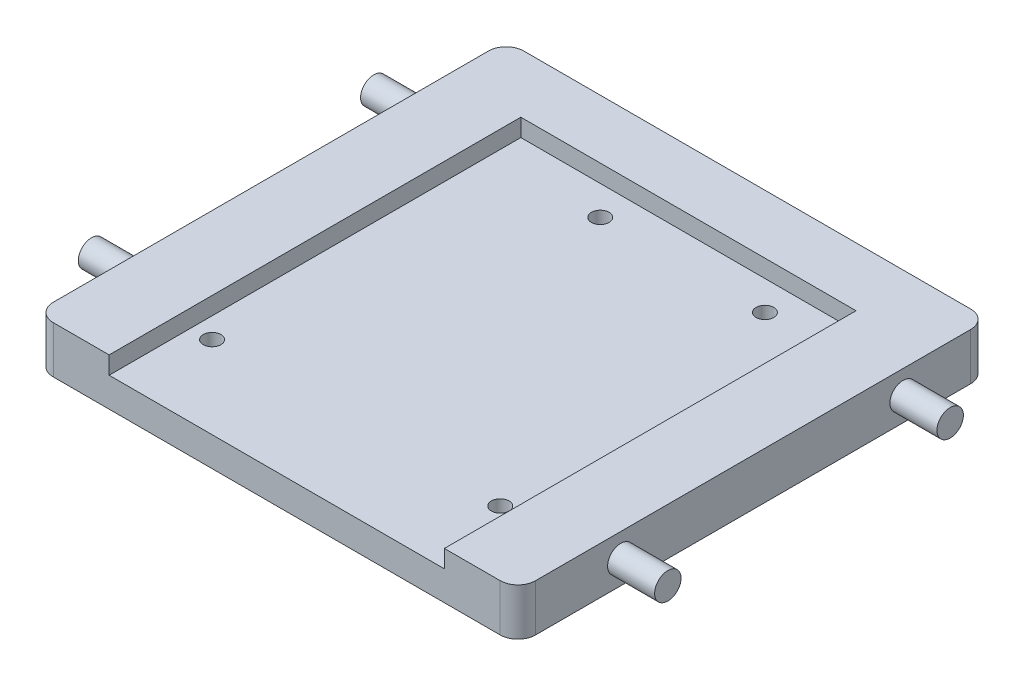
ISO-10303-21;
HEADER;
FILE_DESCRIPTION(('STEP AP214'),'2;1');
FILE_NAME('part.step','',(''),(''),'','','');
FILE_SCHEMA(('AUTOMOTIVE_DESIGN { 1 0 10303 214 1 1 1 1 }'));
ENDSEC;
DATA;
#1=APPLICATION_CONTEXT('core data for automotive mechanical design processes');
#2=APPLICATION_PROTOCOL_DEFINITION('international standard','automotive_design',2000,#1);
#3=PRODUCT_CONTEXT('',#1,'mechanical');
#4=PRODUCT('Part','Part','',(#3));
#5=PRODUCT_RELATED_PRODUCT_CATEGORY('part','',(#4));
#6=PRODUCT_DEFINITION_FORMATION('','',#4);
#7=PRODUCT_DEFINITION_CONTEXT('part definition',#1,'design');
#8=PRODUCT_DEFINITION('design','',#6,#7);
#9=PRODUCT_DEFINITION_SHAPE('','',#8);
#10=(LENGTH_UNIT() NAMED_UNIT(*) SI_UNIT(.MILLI.,.METRE.));
#11=(NAMED_UNIT(*) PLANE_ANGLE_UNIT() SI_UNIT($,.RADIAN.));
#12=(NAMED_UNIT(*) SI_UNIT($,.STERADIAN.) SOLID_ANGLE_UNIT());
#13=UNCERTAINTY_MEASURE_WITH_UNIT(LENGTH_MEASURE(1.E-05),#10,'distance_accuracy_value','');
#14=(GEOMETRIC_REPRESENTATION_CONTEXT(3) GLOBAL_UNCERTAINTY_ASSIGNED_CONTEXT((#13)) GLOBAL_UNIT_ASSIGNED_CONTEXT((#10,
#11,#12)) REPRESENTATION_CONTEXT('',''));
#15=CARTESIAN_POINT('',(0.,0.,0.));
#16=DIRECTION('',(0.,0.,1.));
#17=DIRECTION('',(1.,0.,0.));
#18=AXIS2_PLACEMENT_3D('',#15,#16,#17);
#19=CARTESIAN_POINT('',(-41.,8.,-80.));
#20=DIRECTION('',(1.,0.,0.));
#21=DIRECTION('',(0.,0.,-1.));
#22=AXIS2_PLACEMENT_3D('',#19,#20,#21);
#23=PLANE('',#22);
#24=CARTESIAN_POINT('',(-41.,4.,-65.5));
#25=DIRECTION('',(1.,0.,0.));
#26=DIRECTION('',(0.,0.,-1.));
#27=AXIS2_PLACEMENT_3D('',#24,#25,#26);
#28=CIRCLE('',#27,2.25);
#29=CARTESIAN_POINT('',(-41.,4.,-67.75));
#30=VERTEX_POINT('',#29);
#31=EDGE_CURVE('E196',#30,#30,#28,.T.);
#32=ORIENTED_EDGE('',*,*,#31,.T.);
#33=EDGE_LOOP('',(#32));
#34=FACE_BOUND('',#33,.T.);
#35=CARTESIAN_POINT('',(-41.,4.,-17.5));
#36=DIRECTION('',(1.,0.,0.));
#37=DIRECTION('',(0.,0.,-1.));
#38=AXIS2_PLACEMENT_3D('',#35,#36,#37);
#39=CIRCLE('',#38,2.25);
#40=CARTESIAN_POINT('',(-41.,4.,-19.75));
#41=VERTEX_POINT('',#40);
#42=EDGE_CURVE('E209',#41,#41,#39,.T.);
#43=ORIENTED_EDGE('',*,*,#42,.T.);
#44=EDGE_LOOP('',(#43));
#45=FACE_BOUND('',#44,.T.);
#46=DIRECTION('',(0.,0.,1.));
#47=VECTOR('',#46,1.);
#48=CARTESIAN_POINT('',(-41.,8.,-80.));
#49=LINE('',#48,#47);
#50=CARTESIAN_POINT('',(-41.,8.,-77.));
#51=VERTEX_POINT('',#50);
#52=CARTESIAN_POINT('',(-41.,8.,-3.));
#53=VERTEX_POINT('',#52);
#54=EDGE_CURVE('E214',#51,#53,#49,.T.);
#55=ORIENTED_EDGE('',*,*,#54,.F.);
#56=DIRECTION('',(0.,-1.,0.));
#57=VECTOR('',#56,1.);
#58=CARTESIAN_POINT('',(-41.,8.,-77.));
#59=LINE('',#58,#57);
#60=CARTESIAN_POINT('',(-41.,0.,-77.));
#61=VERTEX_POINT('',#60);
#62=EDGE_CURVE('E250',#51,#61,#59,.T.);
#63=ORIENTED_EDGE('',*,*,#62,.T.);
#64=DIRECTION('',(0.,0.,1.));
#65=VECTOR('',#64,1.);
#66=CARTESIAN_POINT('',(-41.,0.,-80.));
#67=LINE('',#66,#65);
#68=CARTESIAN_POINT('',(-41.,0.,-3.));
#69=VERTEX_POINT('',#68);
#70=EDGE_CURVE('E213',#61,#69,#67,.T.);
#71=ORIENTED_EDGE('',*,*,#70,.T.);
#72=DIRECTION('',(0.,-1.,0.));
#73=VECTOR('',#72,1.);
#74=CARTESIAN_POINT('',(-41.,8.,-3.));
#75=LINE('',#74,#73);
#76=EDGE_CURVE('E229',#69,#53,#75,.F.);
#77=ORIENTED_EDGE('',*,*,#76,.T.);
#78=EDGE_LOOP('',(#55,#63,#71,#77));
#79=FACE_BOUND('',#78,.T.);
#80=ADVANCED_FACE('F41',(#34,#45,#79),#23,.F.);
#81=CARTESIAN_POINT('',(-41.,8.,0.));
#82=DIRECTION('',(0.,0.,-1.));
#83=DIRECTION('',(-1.,0.,0.));
#84=AXIS2_PLACEMENT_3D('',#81,#82,#83);
#85=PLANE('',#84);
#86=DIRECTION('',(1.,0.,0.));
#87=VECTOR('',#86,1.);
#88=CARTESIAN_POINT('',(-41.,0.,0.));
#89=LINE('',#88,#87);
#90=CARTESIAN_POINT('',(-38.,0.,0.));
#91=VERTEX_POINT('',#90);
#92=CARTESIAN_POINT('',(38.,0.,0.));
#93=VERTEX_POINT('',#92);
#94=EDGE_CURVE('E233',#91,#93,#89,.T.);
#95=ORIENTED_EDGE('',*,*,#94,.T.);
#96=DIRECTION('',(0.,-1.,0.));
#97=VECTOR('',#96,1.);
#98=CARTESIAN_POINT('',(38.,8.,0.));
#99=LINE('',#98,#97);
#100=CARTESIAN_POINT('',(38.,8.,0.));
#101=VERTEX_POINT('',#100);
#102=EDGE_CURVE('E12',#93,#101,#99,.F.);
#103=ORIENTED_EDGE('',*,*,#102,.T.);
#104=DIRECTION('',(1.,0.,0.));
#105=VECTOR('',#104,1.);
#106=CARTESIAN_POINT('',(-41.,8.,0.));
#107=LINE('',#106,#105);
#108=CARTESIAN_POINT('',(28.5,8.,0.));
#109=VERTEX_POINT('',#108);
#110=EDGE_CURVE('E217',#109,#101,#107,.T.);
#111=ORIENTED_EDGE('',*,*,#110,.F.);
#112=DIRECTION('',(0.,1.,0.));
#113=VECTOR('',#112,1.);
#114=CARTESIAN_POINT('',(28.5,5.,0.));
#115=LINE('',#114,#113);
#116=CARTESIAN_POINT('',(28.5,5.,0.));
#117=VERTEX_POINT('',#116);
#118=EDGE_CURVE('E144',#117,#109,#115,.T.);
#119=ORIENTED_EDGE('',*,*,#118,.F.);
#120=DIRECTION('',(1.,0.,0.));
#121=VECTOR('',#120,1.);
#122=CARTESIAN_POINT('',(28.5,5.,0.));
#123=LINE('',#122,#121);
#124=CARTESIAN_POINT('',(-28.5,5.,0.));
#125=VERTEX_POINT('',#124);
#126=EDGE_CURVE('E151',#125,#117,#123,.T.);
#127=ORIENTED_EDGE('',*,*,#126,.F.);
#128=DIRECTION('',(0.,1.,0.));
#129=VECTOR('',#128,1.);
#130=CARTESIAN_POINT('',(-28.5,5.,0.));
#131=LINE('',#130,#129);
#132=CARTESIAN_POINT('',(-28.5,8.,0.));
#133=VERTEX_POINT('',#132);
#134=EDGE_CURVE('E134',#125,#133,#131,.T.);
#135=ORIENTED_EDGE('',*,*,#134,.T.);
#136=CARTESIAN_POINT('',(-38.,8.,0.));
#137=VERTEX_POINT('',#136);
#138=EDGE_CURVE('E219',#137,#133,#107,.T.);
#139=ORIENTED_EDGE('',*,*,#138,.F.);
#140=DIRECTION('',(0.,-1.,0.));
#141=VECTOR('',#140,1.);
#142=CARTESIAN_POINT('',(-38.,8.,0.));
#143=LINE('',#142,#141);
#144=EDGE_CURVE('E50',#137,#91,#143,.T.);
#145=ORIENTED_EDGE('',*,*,#144,.T.);
#146=EDGE_LOOP('',(#95,#103,#111,#119,#127,#135,#139,#145));
#147=FACE_BOUND('',#146,.T.);
#148=ADVANCED_FACE('F158',(#147),#85,.F.);
#149=CARTESIAN_POINT('',(41.,8.,0.));
#150=DIRECTION('',(-1.,0.,0.));
#151=DIRECTION('',(0.,0.,1.));
#152=AXIS2_PLACEMENT_3D('',#149,#150,#151);
#153=PLANE('',#152);
#154=CARTESIAN_POINT('',(41.,4.,-65.5));
#155=DIRECTION('',(-1.,0.,0.));
#156=DIRECTION('',(0.,0.,1.));
#157=AXIS2_PLACEMENT_3D('',#154,#155,#156);
#158=CIRCLE('',#157,2.25);
#159=CARTESIAN_POINT('',(41.,4.,-63.25));
#160=VERTEX_POINT('',#159);
#161=EDGE_CURVE('E195',#160,#160,#158,.T.);
#162=ORIENTED_EDGE('',*,*,#161,.T.);
#163=EDGE_LOOP('',(#162));
#164=FACE_BOUND('',#163,.T.);
#165=CARTESIAN_POINT('',(41.,4.,-17.5));
#166=DIRECTION('',(-1.,0.,0.));
#167=DIRECTION('',(0.,0.,1.));
#168=AXIS2_PLACEMENT_3D('',#165,#166,#167);
#169=CIRCLE('',#168,2.25);
#170=CARTESIAN_POINT('',(41.,4.,-15.25));
#171=VERTEX_POINT('',#170);
#172=EDGE_CURVE('E208',#171,#171,#169,.T.);
#173=ORIENTED_EDGE('',*,*,#172,.T.);
#174=EDGE_LOOP('',(#173));
#175=FACE_BOUND('',#174,.T.);
#176=DIRECTION('',(0.,0.,-1.));
#177=VECTOR('',#176,1.);
#178=CARTESIAN_POINT('',(41.,0.,0.));
#179=LINE('',#178,#177);
#180=CARTESIAN_POINT('',(41.,0.,-3.));
#181=VERTEX_POINT('',#180);
#182=CARTESIAN_POINT('',(41.,0.,-77.));
#183=VERTEX_POINT('',#182);
#184=EDGE_CURVE('E236',#181,#183,#179,.T.);
#185=ORIENTED_EDGE('',*,*,#184,.T.);
#186=DIRECTION('',(0.,-1.,0.));
#187=VECTOR('',#186,1.);
#188=CARTESIAN_POINT('',(41.,8.,-77.));
#189=LINE('',#188,#187);
#190=CARTESIAN_POINT('',(41.,8.,-77.));
#191=VERTEX_POINT('',#190);
#192=EDGE_CURVE('E65',#183,#191,#189,.F.);
#193=ORIENTED_EDGE('',*,*,#192,.T.);
#194=DIRECTION('',(0.,0.,-1.));
#195=VECTOR('',#194,1.);
#196=CARTESIAN_POINT('',(41.,8.,0.));
#197=LINE('',#196,#195);
#198=CARTESIAN_POINT('',(41.,8.,-3.));
#199=VERTEX_POINT('',#198);
#200=EDGE_CURVE('E222',#199,#191,#197,.T.);
#201=ORIENTED_EDGE('',*,*,#200,.F.);
#202=DIRECTION('',(0.,-1.,0.));
#203=VECTOR('',#202,1.);
#204=CARTESIAN_POINT('',(41.,8.,-3.));
#205=LINE('',#204,#203);
#206=EDGE_CURVE('E284',#199,#181,#205,.T.);
#207=ORIENTED_EDGE('',*,*,#206,.T.);
#208=EDGE_LOOP('',(#185,#193,#201,#207));
#209=FACE_BOUND('',#208,.T.);
#210=ADVANCED_FACE('F303',(#164,#175,#209),#153,.F.);
#211=CARTESIAN_POINT('',(41.,8.,-80.));
#212=DIRECTION('',(0.,0.,1.));
#213=DIRECTION('',(1.,0.,0.));
#214=AXIS2_PLACEMENT_3D('',#211,#212,#213);
#215=PLANE('',#214);
#216=DIRECTION('',(-1.,0.,0.));
#217=VECTOR('',#216,1.);
#218=CARTESIAN_POINT('',(41.,0.,-80.));
#219=LINE('',#218,#217);
#220=CARTESIAN_POINT('',(38.,0.,-80.));
#221=VERTEX_POINT('',#220);
#222=CARTESIAN_POINT('',(-38.,0.,-80.));
#223=VERTEX_POINT('',#222);
#224=EDGE_CURVE('E218',#221,#223,#219,.T.);
#225=ORIENTED_EDGE('',*,*,#224,.T.);
#226=DIRECTION('',(0.,-1.,0.));
#227=VECTOR('',#226,1.);
#228=CARTESIAN_POINT('',(-38.,8.,-80.));
#229=LINE('',#228,#227);
#230=CARTESIAN_POINT('',(-38.,8.,-80.));
#231=VERTEX_POINT('',#230);
#232=EDGE_CURVE('E270',#223,#231,#229,.F.);
#233=ORIENTED_EDGE('',*,*,#232,.T.);
#234=DIRECTION('',(-1.,0.,0.));
#235=VECTOR('',#234,1.);
#236=CARTESIAN_POINT('',(41.,8.,-80.));
#237=LINE('',#236,#235);
#238=CARTESIAN_POINT('',(38.,8.,-80.));
#239=VERTEX_POINT('',#238);
#240=EDGE_CURVE('E225',#239,#231,#237,.T.);
#241=ORIENTED_EDGE('',*,*,#240,.F.);
#242=DIRECTION('',(0.,-1.,0.));
#243=VECTOR('',#242,1.);
#244=CARTESIAN_POINT('',(38.,8.,-80.));
#245=LINE('',#244,#243);
#246=EDGE_CURVE('E266',#239,#221,#245,.T.);
#247=ORIENTED_EDGE('',*,*,#246,.T.);
#248=EDGE_LOOP('',(#225,#233,#241,#247));
#249=FACE_BOUND('',#248,.T.);
#250=ADVANCED_FACE('F313',(#249),#215,.F.);
#251=CARTESIAN_POINT('',(0.,8.,0.));
#252=DIRECTION('',(0.,1.,0.));
#253=DIRECTION('',(0.,0.,1.));
#254=AXIS2_PLACEMENT_3D('',#251,#252,#253);
#255=PLANE('',#254);
#256=ORIENTED_EDGE('',*,*,#240,.T.);
#257=CARTESIAN_POINT('',(-38.,8.,-77.));
#258=DIRECTION('',(0.,1.,0.));
#259=DIRECTION('',(0.,0.,1.));
#260=AXIS2_PLACEMENT_3D('',#257,#258,#259);
#261=CIRCLE('',#260,3.);
#262=EDGE_CURVE('E281',#231,#51,#261,.T.);
#263=ORIENTED_EDGE('',*,*,#262,.T.);
#264=ORIENTED_EDGE('',*,*,#54,.T.);
#265=CARTESIAN_POINT('',(-38.,8.,-3.));
#266=DIRECTION('',(0.,1.,0.));
#267=DIRECTION('',(0.,0.,1.));
#268=AXIS2_PLACEMENT_3D('',#265,#266,#267);
#269=CIRCLE('',#268,3.);
#270=EDGE_CURVE('E57',#53,#137,#269,.T.);
#271=ORIENTED_EDGE('',*,*,#270,.T.);
#272=ORIENTED_EDGE('',*,*,#138,.T.);
#273=DIRECTION('',(0.,0.,1.));
#274=VECTOR('',#273,1.);
#275=CARTESIAN_POINT('',(-28.5,8.,0.));
#276=LINE('',#275,#274);
#277=CARTESIAN_POINT('',(-28.5,8.,-70.));
#278=VERTEX_POINT('',#277);
#279=EDGE_CURVE('E140',#278,#133,#276,.T.);
#280=ORIENTED_EDGE('',*,*,#279,.F.);
#281=DIRECTION('',(-1.,0.,0.));
#282=VECTOR('',#281,1.);
#283=CARTESIAN_POINT('',(28.5,8.,-70.));
#284=LINE('',#283,#282);
#285=CARTESIAN_POINT('',(28.5,8.,-70.));
#286=VERTEX_POINT('',#285);
#287=EDGE_CURVE('E155',#286,#278,#284,.T.);
#288=ORIENTED_EDGE('',*,*,#287,.F.);
#289=DIRECTION('',(0.,0.,-1.));
#290=VECTOR('',#289,1.);
#291=CARTESIAN_POINT('',(28.5,8.,0.));
#292=LINE('',#291,#290);
#293=EDGE_CURVE('E171',#109,#286,#292,.T.);
#294=ORIENTED_EDGE('',*,*,#293,.F.);
#295=ORIENTED_EDGE('',*,*,#110,.T.);
#296=CARTESIAN_POINT('',(38.,8.,-3.));
#297=DIRECTION('',(0.,1.,0.));
#298=DIRECTION('',(0.,0.,1.));
#299=AXIS2_PLACEMENT_3D('',#296,#297,#298);
#300=CIRCLE('',#299,3.);
#301=EDGE_CURVE('E275',#101,#199,#300,.T.);
#302=ORIENTED_EDGE('',*,*,#301,.T.);
#303=ORIENTED_EDGE('',*,*,#200,.T.);
#304=CARTESIAN_POINT('',(38.,8.,-77.));
#305=DIRECTION('',(0.,1.,0.));
#306=DIRECTION('',(0.,0.,1.));
#307=AXIS2_PLACEMENT_3D('',#304,#305,#306);
#308=CIRCLE('',#307,3.);
#309=EDGE_CURVE('E278',#191,#239,#308,.T.);
#310=ORIENTED_EDGE('',*,*,#309,.T.);
#311=EDGE_LOOP('',(#256,#263,#264,#271,#272,#280,#288,#294,#295,#302,#303,#310));
#312=FACE_BOUND('',#311,.T.);
#313=ADVANCED_FACE('F305',(#312),#255,.T.);
#314=CARTESIAN_POINT('',(0.,0.,0.));
#315=DIRECTION('',(0.,1.,0.));
#316=DIRECTION('',(0.,0.,1.));
#317=AXIS2_PLACEMENT_3D('',#314,#315,#316);
#318=PLANE('',#317);
#319=ORIENTED_EDGE('',*,*,#70,.F.);
#320=CARTESIAN_POINT('',(-38.,0.,-77.));
#321=DIRECTION('',(0.,1.,0.));
#322=DIRECTION('',(0.,0.,1.));
#323=AXIS2_PLACEMENT_3D('',#320,#321,#322);
#324=CIRCLE('',#323,3.);
#325=EDGE_CURVE('E263',#61,#223,#324,.F.);
#326=ORIENTED_EDGE('',*,*,#325,.T.);
#327=ORIENTED_EDGE('',*,*,#224,.F.);
#328=CARTESIAN_POINT('',(38.,0.,-77.));
#329=DIRECTION('',(0.,1.,0.));
#330=DIRECTION('',(0.,0.,1.));
#331=AXIS2_PLACEMENT_3D('',#328,#329,#330);
#332=CIRCLE('',#331,3.);
#333=EDGE_CURVE('E260',#221,#183,#332,.F.);
#334=ORIENTED_EDGE('',*,*,#333,.T.);
#335=ORIENTED_EDGE('',*,*,#184,.F.);
#336=CARTESIAN_POINT('',(38.,0.,-3.));
#337=DIRECTION('',(0.,1.,0.));
#338=DIRECTION('',(0.,0.,1.));
#339=AXIS2_PLACEMENT_3D('',#336,#337,#338);
#340=CIRCLE('',#339,3.);
#341=EDGE_CURVE('E257',#181,#93,#340,.F.);
#342=ORIENTED_EDGE('',*,*,#341,.T.);
#343=ORIENTED_EDGE('',*,*,#94,.F.);
#344=CARTESIAN_POINT('',(-38.,0.,-3.));
#345=DIRECTION('',(0.,1.,0.));
#346=DIRECTION('',(0.,0.,1.));
#347=AXIS2_PLACEMENT_3D('',#344,#345,#346);
#348=CIRCLE('',#347,3.);
#349=EDGE_CURVE('E254',#91,#69,#348,.F.);
#350=ORIENTED_EDGE('',*,*,#349,.T.);
#351=EDGE_LOOP('',(#319,#326,#327,#334,#335,#342,#343,#350));
#352=FACE_BOUND('',#351,.T.);
#353=ADVANCED_FACE('F297',(#352),#318,.F.);
#354=CARTESIAN_POINT('',(49.,4.,-17.5));
#355=DIRECTION('',(1.,0.,0.));
#356=DIRECTION('',(0.,0.,-1.));
#357=AXIS2_PLACEMENT_3D('',#354,#355,#356);
#358=PLANE('',#357);
#359=CARTESIAN_POINT('',(49.,4.,-17.5));
#360=DIRECTION('',(1.,0.,0.));
#361=DIRECTION('',(0.,0.,-1.));
#362=AXIS2_PLACEMENT_3D('',#359,#360,#361);
#363=CIRCLE('',#362,2.25);
#364=CARTESIAN_POINT('',(49.,4.,-19.75));
#365=VERTEX_POINT('',#364);
#366=EDGE_CURVE('E200',#365,#365,#363,.T.);
#367=ORIENTED_EDGE('',*,*,#366,.T.);
#368=EDGE_LOOP('',(#367));
#369=FACE_BOUND('',#368,.T.);
#370=ADVANCED_FACE('F527',(#369),#358,.T.);
#371=CARTESIAN_POINT('',(-63.3639610306789,4.,-17.5));
#372=DIRECTION('',(1.,0.,0.));
#373=DIRECTION('',(0.,0.,-1.));
#374=AXIS2_PLACEMENT_3D('',#371,#372,#373);
#375=CYLINDRICAL_SURFACE('',#374,2.25);
#376=ORIENTED_EDGE('',*,*,#366,.F.);
#377=EDGE_LOOP('',(#376));
#378=FACE_BOUND('',#377,.T.);
#379=ORIENTED_EDGE('',*,*,#172,.F.);
#380=EDGE_LOOP('',(#379));
#381=FACE_BOUND('',#380,.T.);
#382=ADVANCED_FACE('F518',(#378,#381),#375,.T.);
#383=CARTESIAN_POINT('',(-49.,4.,-17.5));
#384=DIRECTION('',(1.,0.,0.));
#385=DIRECTION('',(0.,0.,-1.));
#386=AXIS2_PLACEMENT_3D('',#383,#384,#385);
#387=CIRCLE('',#386,2.25);
#388=CARTESIAN_POINT('',(-49.,4.,-19.75));
#389=VERTEX_POINT('',#388);
#390=EDGE_CURVE('E204',#389,#389,#387,.F.);
#391=ORIENTED_EDGE('',*,*,#390,.F.);
#392=EDGE_LOOP('',(#391));
#393=FACE_BOUND('',#392,.T.);
#394=ORIENTED_EDGE('',*,*,#42,.F.);
#395=EDGE_LOOP('',(#394));
#396=FACE_BOUND('',#395,.T.);
#397=ADVANCED_FACE('F509',(#393,#396),#375,.T.);
#398=CARTESIAN_POINT('',(-49.,8.,-80.));
#399=DIRECTION('',(1.,0.,0.));
#400=DIRECTION('',(0.,0.,-1.));
#401=AXIS2_PLACEMENT_3D('',#398,#399,#400);
#402=PLANE('',#401);
#403=ORIENTED_EDGE('',*,*,#390,.T.);
#404=EDGE_LOOP('',(#403));
#405=FACE_BOUND('',#404,.T.);
#406=ADVANCED_FACE('F500',(#405),#402,.F.);
#407=CARTESIAN_POINT('',(49.,4.,-65.5));
#408=DIRECTION('',(1.,0.,0.));
#409=DIRECTION('',(0.,0.,-1.));
#410=AXIS2_PLACEMENT_3D('',#407,#408,#409);
#411=PLANE('',#410);
#412=CARTESIAN_POINT('',(49.,4.,-65.5));
#413=DIRECTION('',(1.,0.,0.));
#414=DIRECTION('',(0.,0.,-1.));
#415=AXIS2_PLACEMENT_3D('',#412,#413,#414);
#416=CIRCLE('',#415,2.25);
#417=CARTESIAN_POINT('',(49.,4.,-67.75));
#418=VERTEX_POINT('',#417);
#419=EDGE_CURVE('E182',#418,#418,#416,.T.);
#420=ORIENTED_EDGE('',*,*,#419,.T.);
#421=EDGE_LOOP('',(#420));
#422=FACE_BOUND('',#421,.T.);
#423=ADVANCED_FACE('F492',(#422),#411,.T.);
#424=CARTESIAN_POINT('',(-63.3639610306789,4.,-65.5));
#425=DIRECTION('',(1.,0.,0.));
#426=DIRECTION('',(0.,0.,-1.));
#427=AXIS2_PLACEMENT_3D('',#424,#425,#426);
#428=CYLINDRICAL_SURFACE('',#427,2.25);
#429=ORIENTED_EDGE('',*,*,#419,.F.);
#430=EDGE_LOOP('',(#429));
#431=FACE_BOUND('',#430,.T.);
#432=ORIENTED_EDGE('',*,*,#161,.F.);
#433=EDGE_LOOP('',(#432));
#434=FACE_BOUND('',#433,.T.);
#435=ADVANCED_FACE('F483',(#431,#434),#428,.T.);
#436=CARTESIAN_POINT('',(-49.,4.,-65.5));
#437=DIRECTION('',(1.,0.,0.));
#438=DIRECTION('',(0.,0.,-1.));
#439=AXIS2_PLACEMENT_3D('',#436,#437,#438);
#440=CIRCLE('',#439,2.25);
#441=CARTESIAN_POINT('',(-49.,4.,-67.75));
#442=VERTEX_POINT('',#441);
#443=EDGE_CURVE('E191',#442,#442,#440,.F.);
#444=ORIENTED_EDGE('',*,*,#443,.F.);
#445=EDGE_LOOP('',(#444));
#446=FACE_BOUND('',#445,.T.);
#447=ORIENTED_EDGE('',*,*,#31,.F.);
#448=EDGE_LOOP('',(#447));
#449=FACE_BOUND('',#448,.T.);
#450=ADVANCED_FACE('F474',(#446,#449),#428,.T.);
#451=CARTESIAN_POINT('',(-49.,8.,-80.));
#452=DIRECTION('',(1.,0.,0.));
#453=DIRECTION('',(0.,0.,-1.));
#454=AXIS2_PLACEMENT_3D('',#451,#452,#453);
#455=PLANE('',#454);
#456=ORIENTED_EDGE('',*,*,#443,.T.);
#457=EDGE_LOOP('',(#456));
#458=FACE_BOUND('',#457,.T.);
#459=ADVANCED_FACE('F466',(#458),#455,.F.);
#460=CARTESIAN_POINT('',(-28.5,5.,0.));
#461=DIRECTION('',(-1.,0.,0.));
#462=DIRECTION('',(0.,0.,1.));
#463=AXIS2_PLACEMENT_3D('',#460,#461,#462);
#464=PLANE('',#463);
#465=ORIENTED_EDGE('',*,*,#279,.T.);
#466=ORIENTED_EDGE('',*,*,#134,.F.);
#467=DIRECTION('',(0.,0.,1.));
#468=VECTOR('',#467,1.);
#469=CARTESIAN_POINT('',(-28.5,5.,0.));
#470=LINE('',#469,#468);
#471=CARTESIAN_POINT('',(-28.5,5.,-70.));
#472=VERTEX_POINT('',#471);
#473=EDGE_CURVE('E137',#472,#125,#470,.T.);
#474=ORIENTED_EDGE('',*,*,#473,.F.);
#475=DIRECTION('',(0.,1.,0.));
#476=VECTOR('',#475,1.);
#477=CARTESIAN_POINT('',(-28.5,5.,-70.));
#478=LINE('',#477,#476);
#479=EDGE_CURVE('E179',#472,#278,#478,.T.);
#480=ORIENTED_EDGE('',*,*,#479,.T.);
#481=EDGE_LOOP('',(#465,#466,#474,#480));
#482=FACE_BOUND('',#481,.T.);
#483=ADVANCED_FACE('F136',(#482),#464,.F.);
#484=CARTESIAN_POINT('',(28.5,5.,-70.));
#485=DIRECTION('',(0.,0.,-1.));
#486=DIRECTION('',(-1.,0.,0.));
#487=AXIS2_PLACEMENT_3D('',#484,#485,#486);
#488=PLANE('',#487);
#489=ORIENTED_EDGE('',*,*,#287,.T.);
#490=ORIENTED_EDGE('',*,*,#479,.F.);
#491=DIRECTION('',(-1.,0.,0.));
#492=VECTOR('',#491,1.);
#493=CARTESIAN_POINT('',(28.5,5.,-70.));
#494=LINE('',#493,#492);
#495=CARTESIAN_POINT('',(28.5,5.,-70.));
#496=VERTEX_POINT('',#495);
#497=EDGE_CURVE('E145',#496,#472,#494,.T.);
#498=ORIENTED_EDGE('',*,*,#497,.F.);
#499=DIRECTION('',(0.,1.,0.));
#500=VECTOR('',#499,1.);
#501=CARTESIAN_POINT('',(28.5,5.,-70.));
#502=LINE('',#501,#500);
#503=EDGE_CURVE('E183',#496,#286,#502,.T.);
#504=ORIENTED_EDGE('',*,*,#503,.T.);
#505=EDGE_LOOP('',(#489,#490,#498,#504));
#506=FACE_BOUND('',#505,.T.);
#507=ADVANCED_FACE('F449',(#506),#488,.F.);
#508=CARTESIAN_POINT('',(28.5,5.,0.));
#509=DIRECTION('',(1.,0.,0.));
#510=DIRECTION('',(0.,0.,-1.));
#511=AXIS2_PLACEMENT_3D('',#508,#509,#510);
#512=PLANE('',#511);
#513=ORIENTED_EDGE('',*,*,#293,.T.);
#514=ORIENTED_EDGE('',*,*,#503,.F.);
#515=DIRECTION('',(0.,0.,-1.));
#516=VECTOR('',#515,1.);
#517=CARTESIAN_POINT('',(28.5,5.,0.));
#518=LINE('',#517,#516);
#519=EDGE_CURVE('E161',#117,#496,#518,.T.);
#520=ORIENTED_EDGE('',*,*,#519,.F.);
#521=ORIENTED_EDGE('',*,*,#118,.T.);
#522=EDGE_LOOP('',(#513,#514,#520,#521));
#523=FACE_BOUND('',#522,.T.);
#524=ADVANCED_FACE('F440',(#523),#512,.F.);
#525=CARTESIAN_POINT('',(0.,5.,0.));
#526=DIRECTION('',(0.,1.,0.));
#527=DIRECTION('',(0.,0.,1.));
#528=AXIS2_PLACEMENT_3D('',#525,#526,#527);
#529=PLANE('',#528);
#530=CARTESIAN_POINT('',(-25.,5.,-14.));
#531=DIRECTION('',(0.,1.,0.));
#532=DIRECTION('',(0.,0.,1.));
#533=AXIS2_PLACEMENT_3D('',#530,#531,#532);
#534=CIRCLE('',#533,1.5);
#535=CARTESIAN_POINT('',(-25.,5.,-12.5));
#536=VERTEX_POINT('',#535);
#537=EDGE_CURVE('E617',#536,#536,#534,.T.);
#538=ORIENTED_EDGE('',*,*,#537,.F.);
#539=EDGE_LOOP('',(#538));
#540=FACE_BOUND('',#539,.T.);
#541=CARTESIAN_POINT('',(-10.,5.,-65.));
#542=DIRECTION('',(0.,1.,0.));
#543=DIRECTION('',(0.,0.,1.));
#544=AXIS2_PLACEMENT_3D('',#541,#542,#543);
#545=CIRCLE('',#544,1.5);
#546=CARTESIAN_POINT('',(-10.,5.,-63.5));
#547=VERTEX_POINT('',#546);
#548=EDGE_CURVE('E621',#547,#547,#545,.T.);
#549=ORIENTED_EDGE('',*,*,#548,.F.);
#550=EDGE_LOOP('',(#549));
#551=FACE_BOUND('',#550,.T.);
#552=CARTESIAN_POINT('',(18.,5.,-65.0000000000001));
#553=DIRECTION('',(0.,1.,0.));
#554=DIRECTION('',(0.,0.,1.));
#555=AXIS2_PLACEMENT_3D('',#552,#553,#554);
#556=CIRCLE('',#555,1.5);
#557=CARTESIAN_POINT('',(18.,5.,-63.5000000000001));
#558=VERTEX_POINT('',#557);
#559=EDGE_CURVE('E625',#558,#558,#556,.T.);
#560=ORIENTED_EDGE('',*,*,#559,.F.);
#561=EDGE_LOOP('',(#560));
#562=FACE_BOUND('',#561,.T.);
#563=CARTESIAN_POINT('',(24.,5.,-14.));
#564=DIRECTION('',(0.,1.,0.));
#565=DIRECTION('',(0.,0.,1.));
#566=AXIS2_PLACEMENT_3D('',#563,#564,#565);
#567=CIRCLE('',#566,1.5);
#568=CARTESIAN_POINT('',(24.,5.,-12.5));
#569=VERTEX_POINT('',#568);
#570=EDGE_CURVE('E628',#569,#569,#567,.T.);
#571=ORIENTED_EDGE('',*,*,#570,.F.);
#572=EDGE_LOOP('',(#571));
#573=FACE_BOUND('',#572,.T.);
#574=ORIENTED_EDGE('',*,*,#473,.T.);
#575=ORIENTED_EDGE('',*,*,#126,.T.);
#576=ORIENTED_EDGE('',*,*,#519,.T.);
#577=ORIENTED_EDGE('',*,*,#497,.T.);
#578=EDGE_LOOP('',(#574,#575,#576,#577));
#579=FACE_BOUND('',#578,.T.);
#580=ADVANCED_FACE('F149',(#540,#551,#562,#573,#579),#529,.T.);
#581=CARTESIAN_POINT('',(24.,2.,-14.));
#582=DIRECTION('',(0.,1.,0.));
#583=DIRECTION('',(0.,0.,1.));
#584=AXIS2_PLACEMENT_3D('',#581,#582,#583);
#585=CYLINDRICAL_SURFACE('',#584,1.5);
#586=CARTESIAN_POINT('',(24.,2.,-14.));
#587=DIRECTION('',(0.,1.,0.));
#588=DIRECTION('',(0.,0.,1.));
#589=AXIS2_PLACEMENT_3D('',#586,#587,#588);
#590=CIRCLE('',#589,1.5);
#591=CARTESIAN_POINT('',(24.,2.,-12.5));
#592=VERTEX_POINT('',#591);
#593=EDGE_CURVE('E632',#592,#592,#590,.T.);
#594=ORIENTED_EDGE('',*,*,#593,.F.);
#595=EDGE_LOOP('',(#594));
#596=FACE_BOUND('',#595,.T.);
#597=ORIENTED_EDGE('',*,*,#570,.T.);
#598=EDGE_LOOP('',(#597));
#599=FACE_BOUND('',#598,.T.);
#600=ADVANCED_FACE('F423',(#596,#599),#585,.F.);
#601=CARTESIAN_POINT('',(24.,2.,-14.));
#602=DIRECTION('',(0.,1.,0.));
#603=DIRECTION('',(0.,0.,1.));
#604=AXIS2_PLACEMENT_3D('',#601,#602,#603);
#605=PLANE('',#604);
#606=ORIENTED_EDGE('',*,*,#593,.T.);
#607=EDGE_LOOP('',(#606));
#608=FACE_BOUND('',#607,.T.);
#609=ADVANCED_FACE('F414',(#608),#605,.T.);
#610=CARTESIAN_POINT('',(18.,2.,-65.0000000000001));
#611=DIRECTION('',(0.,1.,0.));
#612=DIRECTION('',(0.,0.,1.));
#613=AXIS2_PLACEMENT_3D('',#610,#611,#612);
#614=CYLINDRICAL_SURFACE('',#613,1.5);
#615=CARTESIAN_POINT('',(18.,2.,-65.0000000000001));
#616=DIRECTION('',(0.,1.,0.));
#617=DIRECTION('',(0.,0.,1.));
#618=AXIS2_PLACEMENT_3D('',#615,#616,#617);
#619=CIRCLE('',#618,1.5);
#620=CARTESIAN_POINT('',(18.,2.,-63.5000000000001));
#621=VERTEX_POINT('',#620);
#622=EDGE_CURVE('E631',#621,#621,#619,.T.);
#623=ORIENTED_EDGE('',*,*,#622,.F.);
#624=EDGE_LOOP('',(#623));
#625=FACE_BOUND('',#624,.T.);
#626=ORIENTED_EDGE('',*,*,#559,.T.);
#627=EDGE_LOOP('',(#626));
#628=FACE_BOUND('',#627,.T.);
#629=ADVANCED_FACE('F405',(#625,#628),#614,.F.);
#630=CARTESIAN_POINT('',(18.,2.,-65.0000000000001));
#631=DIRECTION('',(0.,1.,0.));
#632=DIRECTION('',(0.,0.,1.));
#633=AXIS2_PLACEMENT_3D('',#630,#631,#632);
#634=PLANE('',#633);
#635=ORIENTED_EDGE('',*,*,#622,.T.);
#636=EDGE_LOOP('',(#635));
#637=FACE_BOUND('',#636,.T.);
#638=ADVANCED_FACE('F396',(#637),#634,.T.);
#639=CARTESIAN_POINT('',(-10.,2.,-65.));
#640=DIRECTION('',(0.,1.,0.));
#641=DIRECTION('',(0.,0.,1.));
#642=AXIS2_PLACEMENT_3D('',#639,#640,#641);
#643=CYLINDRICAL_SURFACE('',#642,1.5);
#644=CARTESIAN_POINT('',(-10.,2.,-65.));
#645=DIRECTION('',(0.,1.,0.));
#646=DIRECTION('',(0.,0.,1.));
#647=AXIS2_PLACEMENT_3D('',#644,#645,#646);
#648=CIRCLE('',#647,1.5);
#649=CARTESIAN_POINT('',(-10.,2.,-63.5));
#650=VERTEX_POINT('',#649);
#651=EDGE_CURVE('E642',#650,#650,#648,.T.);
#652=ORIENTED_EDGE('',*,*,#651,.F.);
#653=EDGE_LOOP('',(#652));
#654=FACE_BOUND('',#653,.T.);
#655=ORIENTED_EDGE('',*,*,#548,.T.);
#656=EDGE_LOOP('',(#655));
#657=FACE_BOUND('',#656,.T.);
#658=ADVANCED_FACE('F387',(#654,#657),#643,.F.);
#659=CARTESIAN_POINT('',(-10.,2.,-65.));
#660=DIRECTION('',(0.,1.,0.));
#661=DIRECTION('',(0.,0.,1.));
#662=AXIS2_PLACEMENT_3D('',#659,#660,#661);
#663=PLANE('',#662);
#664=ORIENTED_EDGE('',*,*,#651,.T.);
#665=EDGE_LOOP('',(#664));
#666=FACE_BOUND('',#665,.T.);
#667=ADVANCED_FACE('F378',(#666),#663,.T.);
#668=CARTESIAN_POINT('',(-25.,2.,-14.));
#669=DIRECTION('',(0.,1.,0.));
#670=DIRECTION('',(0.,0.,1.));
#671=AXIS2_PLACEMENT_3D('',#668,#669,#670);
#672=CYLINDRICAL_SURFACE('',#671,1.5);
#673=CARTESIAN_POINT('',(-25.,2.,-14.));
#674=DIRECTION('',(0.,1.,0.));
#675=DIRECTION('',(0.,0.,1.));
#676=AXIS2_PLACEMENT_3D('',#673,#674,#675);
#677=CIRCLE('',#676,1.5);
#678=CARTESIAN_POINT('',(-25.,2.,-12.5));
#679=VERTEX_POINT('',#678);
#680=EDGE_CURVE('E172',#679,#679,#677,.T.);
#681=ORIENTED_EDGE('',*,*,#680,.F.);
#682=EDGE_LOOP('',(#681));
#683=FACE_BOUND('',#682,.T.);
#684=ORIENTED_EDGE('',*,*,#537,.T.);
#685=EDGE_LOOP('',(#684));
#686=FACE_BOUND('',#685,.T.);
#687=ADVANCED_FACE('F369',(#683,#686),#672,.F.);
#688=CARTESIAN_POINT('',(-25.,2.,-14.));
#689=DIRECTION('',(0.,1.,0.));
#690=DIRECTION('',(0.,0.,1.));
#691=AXIS2_PLACEMENT_3D('',#688,#689,#690);
#692=PLANE('',#691);
#693=ORIENTED_EDGE('',*,*,#680,.T.);
#694=EDGE_LOOP('',(#693));
#695=FACE_BOUND('',#694,.T.);
#696=ADVANCED_FACE('F338',(#695),#692,.T.);
#697=CARTESIAN_POINT('',(-38.,8.,-77.));
#698=DIRECTION('',(0.,-1.,0.));
#699=DIRECTION('',(0.,0.,-1.));
#700=AXIS2_PLACEMENT_3D('',#697,#698,#699);
#701=CYLINDRICAL_SURFACE('',#700,3.);
#702=ORIENTED_EDGE('',*,*,#262,.F.);
#703=ORIENTED_EDGE('',*,*,#232,.F.);
#704=ORIENTED_EDGE('',*,*,#325,.F.);
#705=ORIENTED_EDGE('',*,*,#62,.F.);
#706=EDGE_LOOP('',(#702,#703,#704,#705));
#707=FACE_BOUND('',#706,.T.);
#708=ADVANCED_FACE('F318',(#707),#701,.T.);
#709=CARTESIAN_POINT('',(38.,8.,-77.));
#710=DIRECTION('',(0.,-1.,0.));
#711=DIRECTION('',(0.,0.,-1.));
#712=AXIS2_PLACEMENT_3D('',#709,#710,#711);
#713=CYLINDRICAL_SURFACE('',#712,3.);
#714=ORIENTED_EDGE('',*,*,#309,.F.);
#715=ORIENTED_EDGE('',*,*,#192,.F.);
#716=ORIENTED_EDGE('',*,*,#333,.F.);
#717=ORIENTED_EDGE('',*,*,#246,.F.);
#718=EDGE_LOOP('',(#714,#715,#716,#717));
#719=FACE_BOUND('',#718,.T.);
#720=ADVANCED_FACE('F310',(#719),#713,.T.);
#721=CARTESIAN_POINT('',(38.,8.,-3.));
#722=DIRECTION('',(0.,-1.,0.));
#723=DIRECTION('',(0.,0.,-1.));
#724=AXIS2_PLACEMENT_3D('',#721,#722,#723);
#725=CYLINDRICAL_SURFACE('',#724,3.);
#726=ORIENTED_EDGE('',*,*,#301,.F.);
#727=ORIENTED_EDGE('',*,*,#102,.F.);
#728=ORIENTED_EDGE('',*,*,#341,.F.);
#729=ORIENTED_EDGE('',*,*,#206,.F.);
#730=EDGE_LOOP('',(#726,#727,#728,#729));
#731=FACE_BOUND('',#730,.T.);
#732=ADVANCED_FACE('F302',(#731),#725,.T.);
#733=CARTESIAN_POINT('',(-38.,8.,-3.));
#734=DIRECTION('',(0.,-1.,0.));
#735=DIRECTION('',(0.,0.,-1.));
#736=AXIS2_PLACEMENT_3D('',#733,#734,#735);
#737=CYLINDRICAL_SURFACE('',#736,3.);
#738=ORIENTED_EDGE('',*,*,#270,.F.);
#739=ORIENTED_EDGE('',*,*,#76,.F.);
#740=ORIENTED_EDGE('',*,*,#349,.F.);
#741=ORIENTED_EDGE('',*,*,#144,.F.);
#742=EDGE_LOOP('',(#738,#739,#740,#741));
#743=FACE_BOUND('',#742,.T.);
#744=ADVANCED_FACE('F43',(#743),#737,.T.);
#745=CLOSED_SHELL('',(#80,#148,#210,#250,#313,#353,#370,#382,#397,#406,#423,#435,#450,#459,#483,
#507,#524,#580,#600,#609,#629,#638,#658,#667,#687,#696,#708,#720,#732,#744));
#746=MANIFOLD_SOLID_BREP('B2',#745);
#747=ADVANCED_BREP_SHAPE_REPRESENTATION('',(#18,#746),#14);
#748=SHAPE_DEFINITION_REPRESENTATION(#9,#747);
ENDSEC;
END-ISO-10303-21;
